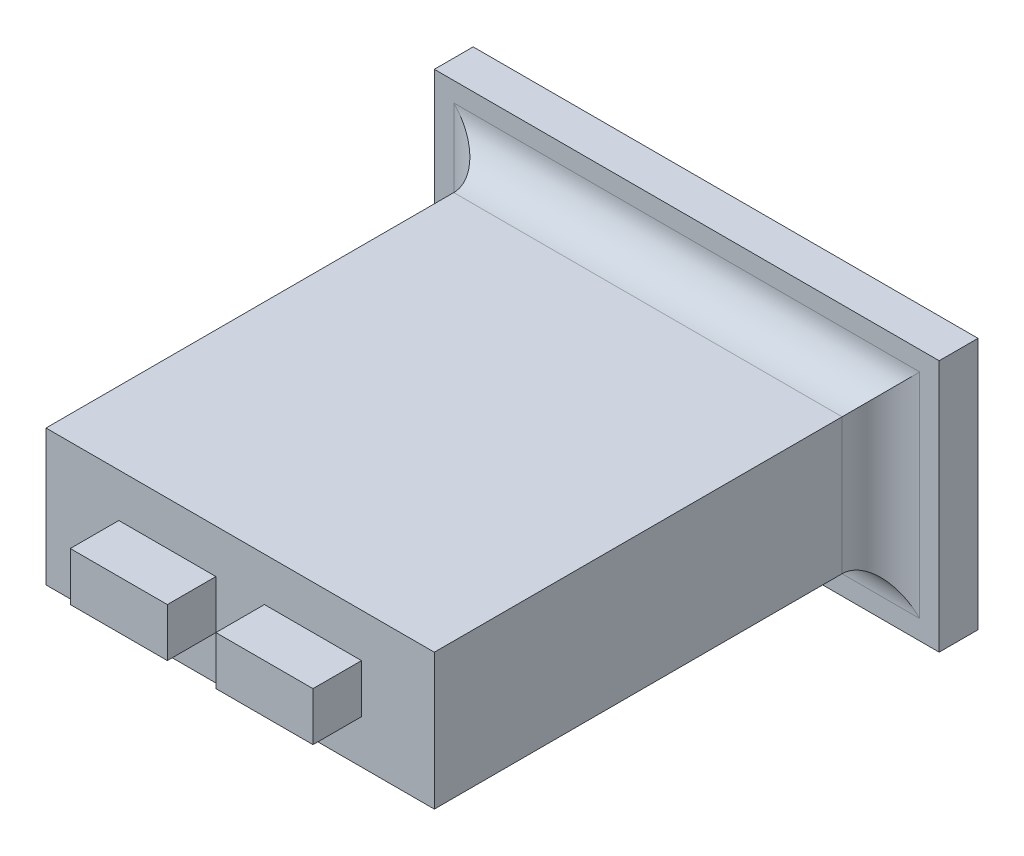
ISO-10303-21;
HEADER;
FILE_DESCRIPTION(('STEP AP214'),'2;1');
FILE_NAME('part.step','',(''),(''),'','','');
FILE_SCHEMA(('AUTOMOTIVE_DESIGN { 1 0 10303 214 1 1 1 1 }'));
ENDSEC;
DATA;
#1=APPLICATION_CONTEXT('core data for automotive mechanical design processes');
#2=APPLICATION_PROTOCOL_DEFINITION('international standard','automotive_design',2000,#1);
#3=PRODUCT_CONTEXT('',#1,'mechanical');
#4=PRODUCT('Part','Part','',(#3));
#5=PRODUCT_RELATED_PRODUCT_CATEGORY('part','',(#4));
#6=PRODUCT_DEFINITION_FORMATION('','',#4);
#7=PRODUCT_DEFINITION_CONTEXT('part definition',#1,'design');
#8=PRODUCT_DEFINITION('design','',#6,#7);
#9=PRODUCT_DEFINITION_SHAPE('','',#8);
#10=(LENGTH_UNIT() NAMED_UNIT(*) SI_UNIT(.MILLI.,.METRE.));
#11=(NAMED_UNIT(*) PLANE_ANGLE_UNIT() SI_UNIT($,.RADIAN.));
#12=(NAMED_UNIT(*) SI_UNIT($,.STERADIAN.) SOLID_ANGLE_UNIT());
#13=UNCERTAINTY_MEASURE_WITH_UNIT(LENGTH_MEASURE(1.E-05),#10,'distance_accuracy_value','');
#14=(GEOMETRIC_REPRESENTATION_CONTEXT(3) GLOBAL_UNCERTAINTY_ASSIGNED_CONTEXT((#13)) GLOBAL_UNIT_ASSIGNED_CONTEXT((#10,
#11,#12)) REPRESENTATION_CONTEXT('',''));
#15=CARTESIAN_POINT('',(0.,0.,0.));
#16=DIRECTION('',(0.,0.,1.));
#17=DIRECTION('',(1.,0.,0.));
#18=AXIS2_PLACEMENT_3D('',#15,#16,#17);
#19=CARTESIAN_POINT('',(0.,0.,23.));
#20=DIRECTION('',(0.,0.,-1.));
#21=DIRECTION('',(-1.,0.,0.));
#22=AXIS2_PLACEMENT_3D('',#19,#20,#21);
#23=PLANE('',#22);
#24=DIRECTION('',(0.,-1.,0.));
#25=VECTOR('',#24,1.);
#26=CARTESIAN_POINT('',(3.75,4.75,23.));
#27=LINE('',#26,#25);
#28=CARTESIAN_POINT('',(3.75,4.75,23.));
#29=VERTEX_POINT('',#28);
#30=CARTESIAN_POINT('',(3.75,2.25,23.));
#31=VERTEX_POINT('',#30);
#32=EDGE_CURVE('E267',#29,#31,#27,.T.);
#33=ORIENTED_EDGE('',*,*,#32,.F.);
#34=DIRECTION('',(-1.,0.,0.));
#35=VECTOR('',#34,1.);
#36=CARTESIAN_POINT('',(3.75,4.75,23.));
#37=LINE('',#36,#35);
#38=CARTESIAN_POINT('',(8.75,4.75,23.));
#39=VERTEX_POINT('',#38);
#40=EDGE_CURVE('E273',#39,#29,#37,.T.);
#41=ORIENTED_EDGE('',*,*,#40,.F.);
#42=DIRECTION('',(0.,1.,0.));
#43=VECTOR('',#42,1.);
#44=CARTESIAN_POINT('',(8.75,4.75,23.));
#45=LINE('',#44,#43);
#46=CARTESIAN_POINT('',(8.75,2.25,23.));
#47=VERTEX_POINT('',#46);
#48=EDGE_CURVE('E290',#47,#39,#45,.T.);
#49=ORIENTED_EDGE('',*,*,#48,.F.);
#50=DIRECTION('',(1.,0.,0.));
#51=VECTOR('',#50,1.);
#52=CARTESIAN_POINT('',(3.75,2.25,23.));
#53=LINE('',#52,#51);
#54=EDGE_CURVE('E286',#31,#47,#53,.T.);
#55=ORIENTED_EDGE('',*,*,#54,.F.);
#56=EDGE_LOOP('',(#33,#41,#49,#55));
#57=FACE_BOUND('',#56,.T.);
#58=DIRECTION('',(0.,-1.,0.));
#59=VECTOR('',#58,1.);
#60=CARTESIAN_POINT('',(0.,0.,23.));
#61=LINE('',#60,#59);
#62=CARTESIAN_POINT('',(0.,7.,23.));
#63=VERTEX_POINT('',#62);
#64=CARTESIAN_POINT('',(0.,0.,23.));
#65=VERTEX_POINT('',#64);
#66=EDGE_CURVE('E312',#63,#65,#61,.T.);
#67=ORIENTED_EDGE('',*,*,#66,.T.);
#68=DIRECTION('',(1.,0.,0.));
#69=VECTOR('',#68,1.);
#70=CARTESIAN_POINT('',(0.,0.,23.));
#71=LINE('',#70,#69);
#72=CARTESIAN_POINT('',(20.,0.,23.));
#73=VERTEX_POINT('',#72);
#74=EDGE_CURVE('E316',#65,#73,#71,.T.);
#75=ORIENTED_EDGE('',*,*,#74,.T.);
#76=DIRECTION('',(0.,1.,0.));
#77=VECTOR('',#76,1.);
#78=CARTESIAN_POINT('',(20.,0.,23.));
#79=LINE('',#78,#77);
#80=CARTESIAN_POINT('',(20.,7.,23.));
#81=VERTEX_POINT('',#80);
#82=EDGE_CURVE('E319',#73,#81,#79,.T.);
#83=ORIENTED_EDGE('',*,*,#82,.T.);
#84=DIRECTION('',(-1.,0.,0.));
#85=VECTOR('',#84,1.);
#86=CARTESIAN_POINT('',(0.,7.,23.));
#87=LINE('',#86,#85);
#88=EDGE_CURVE('E322',#81,#63,#87,.T.);
#89=ORIENTED_EDGE('',*,*,#88,.T.);
#90=EDGE_LOOP('',(#67,#75,#83,#89));
#91=FACE_BOUND('',#90,.T.);
#92=DIRECTION('',(0.,-1.,0.));
#93=VECTOR('',#92,1.);
#94=CARTESIAN_POINT('',(11.25,4.75,23.));
#95=LINE('',#94,#93);
#96=CARTESIAN_POINT('',(11.25,4.75,23.));
#97=VERTEX_POINT('',#96);
#98=CARTESIAN_POINT('',(11.25,2.25,23.));
#99=VERTEX_POINT('',#98);
#100=EDGE_CURVE('E179',#97,#99,#95,.T.);
#101=ORIENTED_EDGE('',*,*,#100,.F.);
#102=DIRECTION('',(-1.,0.,0.));
#103=VECTOR('',#102,1.);
#104=CARTESIAN_POINT('',(11.25,4.75,23.));
#105=LINE('',#104,#103);
#106=CARTESIAN_POINT('',(16.25,4.75,23.));
#107=VERTEX_POINT('',#106);
#108=EDGE_CURVE('E228',#107,#97,#105,.T.);
#109=ORIENTED_EDGE('',*,*,#108,.F.);
#110=DIRECTION('',(0.,1.,0.));
#111=VECTOR('',#110,1.);
#112=CARTESIAN_POINT('',(16.25,4.75,23.));
#113=LINE('',#112,#111);
#114=CARTESIAN_POINT('',(16.25,2.25,23.));
#115=VERTEX_POINT('',#114);
#116=EDGE_CURVE('E245',#115,#107,#113,.T.);
#117=ORIENTED_EDGE('',*,*,#116,.F.);
#118=DIRECTION('',(1.,0.,0.));
#119=VECTOR('',#118,1.);
#120=CARTESIAN_POINT('',(11.25,2.25,23.));
#121=LINE('',#120,#119);
#122=EDGE_CURVE('E241',#99,#115,#121,.T.);
#123=ORIENTED_EDGE('',*,*,#122,.F.);
#124=EDGE_LOOP('',(#101,#109,#117,#123));
#125=FACE_BOUND('',#124,.T.);
#126=ADVANCED_FACE('F39',(#57,#91,#125),#23,.F.);
#127=CARTESIAN_POINT('',(0.,0.,23.));
#128=DIRECTION('',(1.,0.,0.));
#129=DIRECTION('',(0.,0.,-1.));
#130=AXIS2_PLACEMENT_3D('',#127,#128,#129);
#131=PLANE('',#130);
#132=DIRECTION('',(0.,0.,-1.));
#133=VECTOR('',#132,1.);
#134=CARTESIAN_POINT('',(0.,7.,23.));
#135=LINE('',#134,#133);
#136=CARTESIAN_POINT('',(0.,7.,2.));
#137=VERTEX_POINT('',#136);
#138=EDGE_CURVE('E325',#63,#137,#135,.T.);
#139=ORIENTED_EDGE('',*,*,#138,.T.);
#140=DIRECTION('',(0.,-1.,0.));
#141=VECTOR('',#140,1.);
#142=CARTESIAN_POINT('',(0.,0.,2.));
#143=LINE('',#142,#141);
#144=CARTESIAN_POINT('',(0.,0.,2.));
#145=VERTEX_POINT('',#144);
#146=EDGE_CURVE('E63',#137,#145,#143,.T.);
#147=ORIENTED_EDGE('',*,*,#146,.T.);
#148=DIRECTION('',(0.,0.,-1.));
#149=VECTOR('',#148,1.);
#150=CARTESIAN_POINT('',(0.,0.,23.));
#151=LINE('',#150,#149);
#152=EDGE_CURVE('E335',#65,#145,#151,.T.);
#153=ORIENTED_EDGE('',*,*,#152,.F.);
#154=ORIENTED_EDGE('',*,*,#66,.F.);
#155=EDGE_LOOP('',(#139,#147,#153,#154));
#156=FACE_BOUND('',#155,.T.);
#157=ADVANCED_FACE('F395',(#156),#131,.F.);
#158=CARTESIAN_POINT('',(0.,0.,23.));
#159=DIRECTION('',(0.,1.,0.));
#160=DIRECTION('',(0.,0.,1.));
#161=AXIS2_PLACEMENT_3D('',#158,#159,#160);
#162=PLANE('',#161);
#163=ORIENTED_EDGE('',*,*,#152,.T.);
#164=DIRECTION('',(1.,0.,0.));
#165=VECTOR('',#164,1.);
#166=CARTESIAN_POINT('',(20.,0.,2.));
#167=LINE('',#166,#165);
#168=CARTESIAN_POINT('',(20.,0.,2.));
#169=VERTEX_POINT('',#168);
#170=EDGE_CURVE('E11',#145,#169,#167,.T.);
#171=ORIENTED_EDGE('',*,*,#170,.T.);
#172=DIRECTION('',(0.,0.,-1.));
#173=VECTOR('',#172,1.);
#174=CARTESIAN_POINT('',(20.,0.,23.));
#175=LINE('',#174,#173);
#176=EDGE_CURVE('E332',#73,#169,#175,.T.);
#177=ORIENTED_EDGE('',*,*,#176,.F.);
#178=ORIENTED_EDGE('',*,*,#74,.F.);
#179=EDGE_LOOP('',(#163,#171,#177,#178));
#180=FACE_BOUND('',#179,.T.);
#181=ADVANCED_FACE('F401',(#180),#162,.F.);
#182=CARTESIAN_POINT('',(20.,0.,23.));
#183=DIRECTION('',(-1.,0.,0.));
#184=DIRECTION('',(0.,0.,1.));
#185=AXIS2_PLACEMENT_3D('',#182,#183,#184);
#186=PLANE('',#185);
#187=ORIENTED_EDGE('',*,*,#176,.T.);
#188=DIRECTION('',(0.,1.,0.));
#189=VECTOR('',#188,1.);
#190=CARTESIAN_POINT('',(20.,7.,2.));
#191=LINE('',#190,#189);
#192=CARTESIAN_POINT('',(20.,7.,2.));
#193=VERTEX_POINT('',#192);
#194=EDGE_CURVE('E49',#169,#193,#191,.T.);
#195=ORIENTED_EDGE('',*,*,#194,.T.);
#196=DIRECTION('',(0.,0.,-1.));
#197=VECTOR('',#196,1.);
#198=CARTESIAN_POINT('',(20.,7.,23.));
#199=LINE('',#198,#197);
#200=EDGE_CURVE('E328',#81,#193,#199,.T.);
#201=ORIENTED_EDGE('',*,*,#200,.F.);
#202=ORIENTED_EDGE('',*,*,#82,.F.);
#203=EDGE_LOOP('',(#187,#195,#201,#202));
#204=FACE_BOUND('',#203,.T.);
#205=ADVANCED_FACE('F400',(#204),#186,.F.);
#206=CARTESIAN_POINT('',(0.,7.,23.));
#207=DIRECTION('',(0.,-1.,0.));
#208=DIRECTION('',(0.,0.,-1.));
#209=AXIS2_PLACEMENT_3D('',#206,#207,#208);
#210=PLANE('',#209);
#211=ORIENTED_EDGE('',*,*,#200,.T.);
#212=DIRECTION('',(-1.,0.,0.));
#213=VECTOR('',#212,1.);
#214=CARTESIAN_POINT('',(0.,7.,2.));
#215=LINE('',#214,#213);
#216=EDGE_CURVE('E338',#193,#137,#215,.T.);
#217=ORIENTED_EDGE('',*,*,#216,.T.);
#218=ORIENTED_EDGE('',*,*,#138,.F.);
#219=ORIENTED_EDGE('',*,*,#88,.F.);
#220=EDGE_LOOP('',(#211,#217,#218,#219));
#221=FACE_BOUND('',#220,.T.);
#222=ADVANCED_FACE('F391',(#221),#210,.F.);
#223=CARTESIAN_POINT('',(3.75,4.75,25.5));
#224=DIRECTION('',(1.,0.,0.));
#225=DIRECTION('',(0.,1.,0.));
#226=AXIS2_PLACEMENT_3D('',#223,#224,#225);
#227=PLANE('',#226);
#228=ORIENTED_EDGE('',*,*,#32,.T.);
#229=DIRECTION('',(0.,0.,-1.));
#230=VECTOR('',#229,1.);
#231=CARTESIAN_POINT('',(3.75,2.25,25.5));
#232=LINE('',#231,#230);
#233=CARTESIAN_POINT('',(3.75,2.25,25.5));
#234=VERTEX_POINT('',#233);
#235=EDGE_CURVE('E308',#234,#31,#232,.T.);
#236=ORIENTED_EDGE('',*,*,#235,.F.);
#237=DIRECTION('',(0.,-1.,0.));
#238=VECTOR('',#237,1.);
#239=CARTESIAN_POINT('',(3.75,4.75,25.5));
#240=LINE('',#239,#238);
#241=CARTESIAN_POINT('',(3.75,4.75,25.5));
#242=VERTEX_POINT('',#241);
#243=EDGE_CURVE('E268',#242,#234,#240,.T.);
#244=ORIENTED_EDGE('',*,*,#243,.F.);
#245=DIRECTION('',(0.,0.,-1.));
#246=VECTOR('',#245,1.);
#247=CARTESIAN_POINT('',(3.75,4.75,25.5));
#248=LINE('',#247,#246);
#249=EDGE_CURVE('E282',#242,#29,#248,.T.);
#250=ORIENTED_EDGE('',*,*,#249,.T.);
#251=EDGE_LOOP('',(#228,#236,#244,#250));
#252=FACE_BOUND('',#251,.T.);
#253=ADVANCED_FACE('F418',(#252),#227,.F.);
#254=CARTESIAN_POINT('',(3.75,2.25,25.5));
#255=DIRECTION('',(0.,1.,0.));
#256=DIRECTION('',(0.,0.,1.));
#257=AXIS2_PLACEMENT_3D('',#254,#255,#256);
#258=PLANE('',#257);
#259=ORIENTED_EDGE('',*,*,#54,.T.);
#260=DIRECTION('',(0.,0.,-1.));
#261=VECTOR('',#260,1.);
#262=CARTESIAN_POINT('',(8.75,2.25,25.5));
#263=LINE('',#262,#261);
#264=CARTESIAN_POINT('',(8.75,2.25,25.5));
#265=VERTEX_POINT('',#264);
#266=EDGE_CURVE('E304',#265,#47,#263,.T.);
#267=ORIENTED_EDGE('',*,*,#266,.F.);
#268=DIRECTION('',(1.,0.,0.));
#269=VECTOR('',#268,1.);
#270=CARTESIAN_POINT('',(3.75,2.25,25.5));
#271=LINE('',#270,#269);
#272=EDGE_CURVE('E272',#234,#265,#271,.T.);
#273=ORIENTED_EDGE('',*,*,#272,.F.);
#274=ORIENTED_EDGE('',*,*,#235,.T.);
#275=EDGE_LOOP('',(#259,#267,#273,#274));
#276=FACE_BOUND('',#275,.T.);
#277=ADVANCED_FACE('F425',(#276),#258,.F.);
#278=CARTESIAN_POINT('',(8.75,4.75,25.5));
#279=DIRECTION('',(-1.,0.,0.));
#280=DIRECTION('',(0.,0.,1.));
#281=AXIS2_PLACEMENT_3D('',#278,#279,#280);
#282=PLANE('',#281);
#283=ORIENTED_EDGE('',*,*,#48,.T.);
#284=DIRECTION('',(0.,0.,-1.));
#285=VECTOR('',#284,1.);
#286=CARTESIAN_POINT('',(8.75,4.75,25.5));
#287=LINE('',#286,#285);
#288=CARTESIAN_POINT('',(8.75,4.75,25.5));
#289=VERTEX_POINT('',#288);
#290=EDGE_CURVE('E300',#289,#39,#287,.T.);
#291=ORIENTED_EDGE('',*,*,#290,.F.);
#292=DIRECTION('',(0.,1.,0.));
#293=VECTOR('',#292,1.);
#294=CARTESIAN_POINT('',(8.75,4.75,25.5));
#295=LINE('',#294,#293);
#296=EDGE_CURVE('E276',#265,#289,#295,.T.);
#297=ORIENTED_EDGE('',*,*,#296,.F.);
#298=ORIENTED_EDGE('',*,*,#266,.T.);
#299=EDGE_LOOP('',(#283,#291,#297,#298));
#300=FACE_BOUND('',#299,.T.);
#301=ADVANCED_FACE('F430',(#300),#282,.F.);
#302=CARTESIAN_POINT('',(3.75,4.75,25.5));
#303=DIRECTION('',(0.,-1.,0.));
#304=DIRECTION('',(1.,0.,0.));
#305=AXIS2_PLACEMENT_3D('',#302,#303,#304);
#306=PLANE('',#305);
#307=ORIENTED_EDGE('',*,*,#40,.T.);
#308=ORIENTED_EDGE('',*,*,#249,.F.);
#309=DIRECTION('',(-1.,0.,0.));
#310=VECTOR('',#309,1.);
#311=CARTESIAN_POINT('',(3.75,4.75,25.5));
#312=LINE('',#311,#310);
#313=EDGE_CURVE('E279',#289,#242,#312,.T.);
#314=ORIENTED_EDGE('',*,*,#313,.F.);
#315=ORIENTED_EDGE('',*,*,#290,.T.);
#316=EDGE_LOOP('',(#307,#308,#314,#315));
#317=FACE_BOUND('',#316,.T.);
#318=ADVANCED_FACE('F436',(#317),#306,.F.);
#319=CARTESIAN_POINT('',(0.,0.,25.5));
#320=DIRECTION('',(0.,0.,1.));
#321=DIRECTION('',(1.,0.,0.));
#322=AXIS2_PLACEMENT_3D('',#319,#320,#321);
#323=PLANE('',#322);
#324=ORIENTED_EDGE('',*,*,#243,.T.);
#325=ORIENTED_EDGE('',*,*,#272,.T.);
#326=ORIENTED_EDGE('',*,*,#296,.T.);
#327=ORIENTED_EDGE('',*,*,#313,.T.);
#328=EDGE_LOOP('',(#324,#325,#326,#327));
#329=FACE_BOUND('',#328,.T.);
#330=ADVANCED_FACE('F443',(#329),#323,.T.);
#331=CARTESIAN_POINT('',(11.25,4.75,25.5));
#332=DIRECTION('',(1.,0.,0.));
#333=DIRECTION('',(0.,0.,-1.));
#334=AXIS2_PLACEMENT_3D('',#331,#332,#333);
#335=PLANE('',#334);
#336=ORIENTED_EDGE('',*,*,#100,.T.);
#337=DIRECTION('',(0.,0.,-1.));
#338=VECTOR('',#337,1.);
#339=CARTESIAN_POINT('',(11.25,2.25,25.5));
#340=LINE('',#339,#338);
#341=CARTESIAN_POINT('',(11.25,2.25,25.5));
#342=VERTEX_POINT('',#341);
#343=EDGE_CURVE('E263',#342,#99,#340,.T.);
#344=ORIENTED_EDGE('',*,*,#343,.F.);
#345=DIRECTION('',(0.,-1.,0.));
#346=VECTOR('',#345,1.);
#347=CARTESIAN_POINT('',(11.25,4.75,25.5));
#348=LINE('',#347,#346);
#349=CARTESIAN_POINT('',(11.25,4.75,25.5));
#350=VERTEX_POINT('',#349);
#351=EDGE_CURVE('E223',#350,#342,#348,.T.);
#352=ORIENTED_EDGE('',*,*,#351,.F.);
#353=DIRECTION('',(0.,0.,-1.));
#354=VECTOR('',#353,1.);
#355=CARTESIAN_POINT('',(11.25,4.75,25.5));
#356=LINE('',#355,#354);
#357=EDGE_CURVE('E237',#350,#97,#356,.T.);
#358=ORIENTED_EDGE('',*,*,#357,.T.);
#359=EDGE_LOOP('',(#336,#344,#352,#358));
#360=FACE_BOUND('',#359,.T.);
#361=ADVANCED_FACE('F445',(#360),#335,.F.);
#362=CARTESIAN_POINT('',(11.25,2.25,25.5));
#363=DIRECTION('',(0.,1.,0.));
#364=DIRECTION('',(0.,0.,1.));
#365=AXIS2_PLACEMENT_3D('',#362,#363,#364);
#366=PLANE('',#365);
#367=ORIENTED_EDGE('',*,*,#122,.T.);
#368=DIRECTION('',(0.,0.,-1.));
#369=VECTOR('',#368,1.);
#370=CARTESIAN_POINT('',(16.25,2.25,25.5));
#371=LINE('',#370,#369);
#372=CARTESIAN_POINT('',(16.25,2.25,25.5));
#373=VERTEX_POINT('',#372);
#374=EDGE_CURVE('E259',#373,#115,#371,.T.);
#375=ORIENTED_EDGE('',*,*,#374,.F.);
#376=DIRECTION('',(1.,0.,0.));
#377=VECTOR('',#376,1.);
#378=CARTESIAN_POINT('',(11.25,2.25,25.5));
#379=LINE('',#378,#377);
#380=EDGE_CURVE('E227',#342,#373,#379,.T.);
#381=ORIENTED_EDGE('',*,*,#380,.F.);
#382=ORIENTED_EDGE('',*,*,#343,.T.);
#383=EDGE_LOOP('',(#367,#375,#381,#382));
#384=FACE_BOUND('',#383,.T.);
#385=ADVANCED_FACE('F451',(#384),#366,.F.);
#386=CARTESIAN_POINT('',(16.25,4.75,25.5));
#387=DIRECTION('',(-1.,0.,0.));
#388=DIRECTION('',(0.,0.,1.));
#389=AXIS2_PLACEMENT_3D('',#386,#387,#388);
#390=PLANE('',#389);
#391=ORIENTED_EDGE('',*,*,#116,.T.);
#392=DIRECTION('',(0.,0.,-1.));
#393=VECTOR('',#392,1.);
#394=CARTESIAN_POINT('',(16.25,4.75,25.5));
#395=LINE('',#394,#393);
#396=CARTESIAN_POINT('',(16.25,4.75,25.5));
#397=VERTEX_POINT('',#396);
#398=EDGE_CURVE('E255',#397,#107,#395,.T.);
#399=ORIENTED_EDGE('',*,*,#398,.F.);
#400=DIRECTION('',(0.,1.,0.));
#401=VECTOR('',#400,1.);
#402=CARTESIAN_POINT('',(16.25,4.75,25.5));
#403=LINE('',#402,#401);
#404=EDGE_CURVE('E231',#373,#397,#403,.T.);
#405=ORIENTED_EDGE('',*,*,#404,.F.);
#406=ORIENTED_EDGE('',*,*,#374,.T.);
#407=EDGE_LOOP('',(#391,#399,#405,#406));
#408=FACE_BOUND('',#407,.T.);
#409=ADVANCED_FACE('F485',(#408),#390,.F.);
#410=CARTESIAN_POINT('',(11.25,4.75,25.5));
#411=DIRECTION('',(0.,-1.,0.));
#412=DIRECTION('',(0.,0.,-1.));
#413=AXIS2_PLACEMENT_3D('',#410,#411,#412);
#414=PLANE('',#413);
#415=ORIENTED_EDGE('',*,*,#108,.T.);
#416=ORIENTED_EDGE('',*,*,#357,.F.);
#417=DIRECTION('',(-1.,0.,0.));
#418=VECTOR('',#417,1.);
#419=CARTESIAN_POINT('',(11.25,4.75,25.5));
#420=LINE('',#419,#418);
#421=EDGE_CURVE('E234',#397,#350,#420,.T.);
#422=ORIENTED_EDGE('',*,*,#421,.F.);
#423=ORIENTED_EDGE('',*,*,#398,.T.);
#424=EDGE_LOOP('',(#415,#416,#422,#423));
#425=FACE_BOUND('',#424,.T.);
#426=ADVANCED_FACE('F494',(#425),#414,.F.);
#427=CARTESIAN_POINT('',(0.,0.,25.5));
#428=DIRECTION('',(0.,0.,1.));
#429=DIRECTION('',(1.,0.,0.));
#430=AXIS2_PLACEMENT_3D('',#427,#428,#429);
#431=PLANE('',#430);
#432=ORIENTED_EDGE('',*,*,#351,.T.);
#433=ORIENTED_EDGE('',*,*,#380,.T.);
#434=ORIENTED_EDGE('',*,*,#404,.T.);
#435=ORIENTED_EDGE('',*,*,#421,.T.);
#436=EDGE_LOOP('',(#432,#433,#434,#435));
#437=FACE_BOUND('',#436,.T.);
#438=ADVANCED_FACE('F504',(#437),#431,.T.);
#439=CARTESIAN_POINT('',(23.,0.,-2.));
#440=DIRECTION('',(1.,0.,0.));
#441=DIRECTION('',(0.,0.,-1.));
#442=AXIS2_PLACEMENT_3D('',#439,#440,#441);
#443=PLANE('',#442);
#444=DIRECTION('',(0.,1.,0.));
#445=VECTOR('',#444,1.);
#446=CARTESIAN_POINT('',(23.,0.,0.));
#447=LINE('',#446,#445);
#448=CARTESIAN_POINT('',(23.,-3.,0.));
#449=VERTEX_POINT('',#448);
#450=CARTESIAN_POINT('',(23.,10.,0.));
#451=VERTEX_POINT('',#450);
#452=EDGE_CURVE('E174',#449,#451,#447,.T.);
#453=ORIENTED_EDGE('',*,*,#452,.F.);
#454=DIRECTION('',(0.,0.,1.));
#455=VECTOR('',#454,1.);
#456=CARTESIAN_POINT('',(23.,-3.,-2.));
#457=LINE('',#456,#455);
#458=CARTESIAN_POINT('',(23.,-3.,-2.));
#459=VERTEX_POINT('',#458);
#460=EDGE_CURVE('E168',#459,#449,#457,.T.);
#461=ORIENTED_EDGE('',*,*,#460,.F.);
#462=DIRECTION('',(0.,1.,0.));
#463=VECTOR('',#462,1.);
#464=CARTESIAN_POINT('',(23.,0.,-2.));
#465=LINE('',#464,#463);
#466=CARTESIAN_POINT('',(23.,10.,-2.));
#467=VERTEX_POINT('',#466);
#468=EDGE_CURVE('E172',#459,#467,#465,.T.);
#469=ORIENTED_EDGE('',*,*,#468,.T.);
#470=DIRECTION('',(0.,0.,1.));
#471=VECTOR('',#470,1.);
#472=CARTESIAN_POINT('',(23.,10.,-2.));
#473=LINE('',#472,#471);
#474=EDGE_CURVE('E207',#467,#451,#473,.T.);
#475=ORIENTED_EDGE('',*,*,#474,.T.);
#476=EDGE_LOOP('',(#453,#461,#469,#475));
#477=FACE_BOUND('',#476,.T.);
#478=ADVANCED_FACE('F170',(#477),#443,.T.);
#479=CARTESIAN_POINT('',(0.,-3.,-2.));
#480=DIRECTION('',(0.,1.,0.));
#481=DIRECTION('',(0.,0.,1.));
#482=AXIS2_PLACEMENT_3D('',#479,#480,#481);
#483=PLANE('',#482);
#484=DIRECTION('',(-1.,0.,0.));
#485=VECTOR('',#484,1.);
#486=CARTESIAN_POINT('',(0.,-3.,0.));
#487=LINE('',#486,#485);
#488=CARTESIAN_POINT('',(-3.,-3.,0.));
#489=VERTEX_POINT('',#488);
#490=EDGE_CURVE('E210',#449,#489,#487,.T.);
#491=ORIENTED_EDGE('',*,*,#490,.T.);
#492=DIRECTION('',(0.,0.,1.));
#493=VECTOR('',#492,1.);
#494=CARTESIAN_POINT('',(-3.,-3.,-2.));
#495=LINE('',#494,#493);
#496=CARTESIAN_POINT('',(-3.,-3.,-2.));
#497=VERTEX_POINT('',#496);
#498=EDGE_CURVE('E180',#497,#489,#495,.T.);
#499=ORIENTED_EDGE('',*,*,#498,.F.);
#500=DIRECTION('',(-1.,0.,0.));
#501=VECTOR('',#500,1.);
#502=CARTESIAN_POINT('',(0.,-3.,-2.));
#503=LINE('',#502,#501);
#504=EDGE_CURVE('E183',#459,#497,#503,.T.);
#505=ORIENTED_EDGE('',*,*,#504,.F.);
#506=ORIENTED_EDGE('',*,*,#460,.T.);
#507=EDGE_LOOP('',(#491,#499,#505,#506));
#508=FACE_BOUND('',#507,.T.);
#509=ADVANCED_FACE('F184',(#508),#483,.F.);
#510=CARTESIAN_POINT('',(-3.,0.,-2.));
#511=DIRECTION('',(-1.,0.,0.));
#512=DIRECTION('',(0.,0.,1.));
#513=AXIS2_PLACEMENT_3D('',#510,#511,#512);
#514=PLANE('',#513);
#515=DIRECTION('',(0.,-1.,0.));
#516=VECTOR('',#515,1.);
#517=CARTESIAN_POINT('',(-3.,0.,0.));
#518=LINE('',#517,#516);
#519=CARTESIAN_POINT('',(-3.,10.,0.));
#520=VERTEX_POINT('',#519);
#521=EDGE_CURVE('E200',#520,#489,#518,.T.);
#522=ORIENTED_EDGE('',*,*,#521,.F.);
#523=DIRECTION('',(0.,0.,1.));
#524=VECTOR('',#523,1.);
#525=CARTESIAN_POINT('',(-3.,10.,-2.));
#526=LINE('',#525,#524);
#527=CARTESIAN_POINT('',(-3.,10.,-2.));
#528=VERTEX_POINT('',#527);
#529=EDGE_CURVE('E218',#528,#520,#526,.T.);
#530=ORIENTED_EDGE('',*,*,#529,.F.);
#531=DIRECTION('',(0.,-1.,0.));
#532=VECTOR('',#531,1.);
#533=CARTESIAN_POINT('',(-3.,0.,-2.));
#534=LINE('',#533,#532);
#535=EDGE_CURVE('E189',#528,#497,#534,.T.);
#536=ORIENTED_EDGE('',*,*,#535,.T.);
#537=ORIENTED_EDGE('',*,*,#498,.T.);
#538=EDGE_LOOP('',(#522,#530,#536,#537));
#539=FACE_BOUND('',#538,.T.);
#540=ADVANCED_FACE('F532',(#539),#514,.T.);
#541=CARTESIAN_POINT('',(0.,9.99999999999999,-2.));
#542=DIRECTION('',(0.,-1.,0.));
#543=DIRECTION('',(1.,0.,0.));
#544=AXIS2_PLACEMENT_3D('',#541,#542,#543);
#545=PLANE('',#544);
#546=DIRECTION('',(1.,0.,0.));
#547=VECTOR('',#546,1.);
#548=CARTESIAN_POINT('',(0.,9.99999999999999,0.));
#549=LINE('',#548,#547);
#550=EDGE_CURVE('E196',#520,#451,#549,.T.);
#551=ORIENTED_EDGE('',*,*,#550,.T.);
#552=ORIENTED_EDGE('',*,*,#474,.F.);
#553=DIRECTION('',(1.,0.,0.));
#554=VECTOR('',#553,1.);
#555=CARTESIAN_POINT('',(0.,9.99999999999999,-2.));
#556=LINE('',#555,#554);
#557=EDGE_CURVE('E193',#528,#467,#556,.T.);
#558=ORIENTED_EDGE('',*,*,#557,.F.);
#559=ORIENTED_EDGE('',*,*,#529,.T.);
#560=EDGE_LOOP('',(#551,#552,#558,#559));
#561=FACE_BOUND('',#560,.T.);
#562=ADVANCED_FACE('F541',(#561),#545,.F.);
#563=CARTESIAN_POINT('',(0.,0.,-2.));
#564=DIRECTION('',(0.,0.,-1.));
#565=DIRECTION('',(-1.,0.,0.));
#566=AXIS2_PLACEMENT_3D('',#563,#564,#565);
#567=PLANE('',#566);
#568=ORIENTED_EDGE('',*,*,#468,.F.);
#569=ORIENTED_EDGE('',*,*,#504,.T.);
#570=ORIENTED_EDGE('',*,*,#535,.F.);
#571=ORIENTED_EDGE('',*,*,#557,.T.);
#572=EDGE_LOOP('',(#568,#569,#570,#571));
#573=FACE_BOUND('',#572,.T.);
#574=ADVANCED_FACE('F191',(#573),#567,.T.);
#575=CARTESIAN_POINT('',(0.,0.,0.));
#576=DIRECTION('',(0.,0.,-1.));
#577=DIRECTION('',(-1.,0.,0.));
#578=AXIS2_PLACEMENT_3D('',#575,#576,#577);
#579=PLANE('',#578);
#580=DIRECTION('',(0.,-1.,0.));
#581=VECTOR('',#580,1.);
#582=CARTESIAN_POINT('',(-2.,7.,0.));
#583=LINE('',#582,#581);
#584=CARTESIAN_POINT('',(-2.,-2.,0.));
#585=VERTEX_POINT('',#584);
#586=CARTESIAN_POINT('',(-2.,9.,0.));
#587=VERTEX_POINT('',#586);
#588=EDGE_CURVE('E348',#585,#587,#583,.F.);
#589=ORIENTED_EDGE('',*,*,#588,.T.);
#590=DIRECTION('',(-1.,0.,0.));
#591=VECTOR('',#590,1.);
#592=CARTESIAN_POINT('',(20.,9.,0.));
#593=LINE('',#592,#591);
#594=CARTESIAN_POINT('',(22.,9.,0.));
#595=VERTEX_POINT('',#594);
#596=EDGE_CURVE('E351',#587,#595,#593,.F.);
#597=ORIENTED_EDGE('',*,*,#596,.T.);
#598=DIRECTION('',(0.,1.,0.));
#599=VECTOR('',#598,1.);
#600=CARTESIAN_POINT('',(22.,0.,0.));
#601=LINE('',#600,#599);
#602=CARTESIAN_POINT('',(22.,-2.,0.));
#603=VERTEX_POINT('',#602);
#604=EDGE_CURVE('E345',#595,#603,#601,.F.);
#605=ORIENTED_EDGE('',*,*,#604,.T.);
#606=DIRECTION('',(1.,0.,0.));
#607=VECTOR('',#606,1.);
#608=CARTESIAN_POINT('',(0.,-2.,0.));
#609=LINE('',#608,#607);
#610=EDGE_CURVE('E342',#603,#585,#609,.F.);
#611=ORIENTED_EDGE('',*,*,#610,.T.);
#612=EDGE_LOOP('',(#589,#597,#605,#611));
#613=FACE_BOUND('',#612,.T.);
#614=ORIENTED_EDGE('',*,*,#452,.T.);
#615=ORIENTED_EDGE('',*,*,#550,.F.);
#616=ORIENTED_EDGE('',*,*,#521,.T.);
#617=ORIENTED_EDGE('',*,*,#490,.F.);
#618=EDGE_LOOP('',(#614,#615,#616,#617));
#619=FACE_BOUND('',#618,.T.);
#620=ADVANCED_FACE('F381',(#613,#619),#579,.F.);
#621=CARTESIAN_POINT('',(0.,-2.,2.));
#622=DIRECTION('',(-1.,0.,0.));
#623=DIRECTION('',(0.,0.,1.));
#624=AXIS2_PLACEMENT_3D('',#621,#622,#623);
#625=CYLINDRICAL_SURFACE('',#624,2.);
#626=CARTESIAN_POINT('',(-2.,-2.,2.));
#627=DIRECTION('',(-0.707106781186547,0.707106781186547,0.));
#628=DIRECTION('',(-0.707106781186547,-0.707106781186547,0.));
#629=AXIS2_PLACEMENT_3D('',#626,#627,#628);
#630=ELLIPSE('',#629,2.82842712474619,2.);
#631=EDGE_CURVE('E364',#585,#145,#630,.F.);
#632=ORIENTED_EDGE('',*,*,#631,.F.);
#633=ORIENTED_EDGE('',*,*,#610,.F.);
#634=CARTESIAN_POINT('',(22.,-2.,2.));
#635=DIRECTION('',(-0.707106781186547,-0.707106781186547,0.));
#636=DIRECTION('',(-0.707106781186547,0.707106781186547,0.));
#637=AXIS2_PLACEMENT_3D('',#634,#635,#636);
#638=ELLIPSE('',#637,2.82842712474619,2.);
#639=EDGE_CURVE('E43',#169,#603,#638,.T.);
#640=ORIENTED_EDGE('',*,*,#639,.F.);
#641=ORIENTED_EDGE('',*,*,#170,.F.);
#642=EDGE_LOOP('',(#632,#633,#640,#641));
#643=FACE_BOUND('',#642,.T.);
#644=ADVANCED_FACE('F41',(#643),#625,.F.);
#645=CARTESIAN_POINT('',(22.,0.,2.));
#646=DIRECTION('',(0.,-1.,0.));
#647=DIRECTION('',(0.,0.,-1.));
#648=AXIS2_PLACEMENT_3D('',#645,#646,#647);
#649=CYLINDRICAL_SURFACE('',#648,2.);
#650=ORIENTED_EDGE('',*,*,#639,.T.);
#651=ORIENTED_EDGE('',*,*,#604,.F.);
#652=CARTESIAN_POINT('',(22.,9.,2.));
#653=DIRECTION('',(0.707106781186547,-0.707106781186547,0.));
#654=DIRECTION('',(-0.707106781186547,-0.707106781186547,0.));
#655=AXIS2_PLACEMENT_3D('',#652,#653,#654);
#656=ELLIPSE('',#655,2.82842712474619,2.);
#657=EDGE_CURVE('E362',#193,#595,#656,.T.);
#658=ORIENTED_EDGE('',*,*,#657,.F.);
#659=ORIENTED_EDGE('',*,*,#194,.F.);
#660=EDGE_LOOP('',(#650,#651,#658,#659));
#661=FACE_BOUND('',#660,.T.);
#662=ADVANCED_FACE('F376',(#661),#649,.F.);
#663=CARTESIAN_POINT('',(-2.,0.,2.));
#664=DIRECTION('',(0.,1.,0.));
#665=DIRECTION('',(0.,0.,1.));
#666=AXIS2_PLACEMENT_3D('',#663,#664,#665);
#667=CYLINDRICAL_SURFACE('',#666,2.);
#668=ORIENTED_EDGE('',*,*,#631,.T.);
#669=ORIENTED_EDGE('',*,*,#146,.F.);
#670=CARTESIAN_POINT('',(-2.,9.,2.));
#671=DIRECTION('',(0.707106781186547,0.707106781186547,0.));
#672=DIRECTION('',(-0.707106781186547,0.707106781186547,0.));
#673=AXIS2_PLACEMENT_3D('',#670,#671,#672);
#674=ELLIPSE('',#673,2.82842712474619,2.);
#675=EDGE_CURVE('E359',#587,#137,#674,.F.);
#676=ORIENTED_EDGE('',*,*,#675,.F.);
#677=ORIENTED_EDGE('',*,*,#588,.F.);
#678=EDGE_LOOP('',(#668,#669,#676,#677));
#679=FACE_BOUND('',#678,.T.);
#680=ADVANCED_FACE('F388',(#679),#667,.F.);
#681=CARTESIAN_POINT('',(0.,9.,2.));
#682=DIRECTION('',(1.,0.,0.));
#683=DIRECTION('',(0.,0.,-1.));
#684=AXIS2_PLACEMENT_3D('',#681,#682,#683);
#685=CYLINDRICAL_SURFACE('',#684,2.);
#686=ORIENTED_EDGE('',*,*,#657,.T.);
#687=ORIENTED_EDGE('',*,*,#596,.F.);
#688=ORIENTED_EDGE('',*,*,#675,.T.);
#689=ORIENTED_EDGE('',*,*,#216,.F.);
#690=EDGE_LOOP('',(#686,#687,#688,#689));
#691=FACE_BOUND('',#690,.T.);
#692=ADVANCED_FACE('F386',(#691),#685,.F.);
#693=CLOSED_SHELL('',(#126,#157,#181,#205,#222,#253,#277,#301,#318,#330,#361,#385,#409,#426,
#438,#478,#509,#540,#562,#574,#620,#644,#662,#680,#692));
#694=MANIFOLD_SOLID_BREP('B2',#693);
#695=ADVANCED_BREP_SHAPE_REPRESENTATION('',(#18,#694),#14);
#696=SHAPE_DEFINITION_REPRESENTATION(#9,#695);
ENDSEC;
END-ISO-10303-21;
